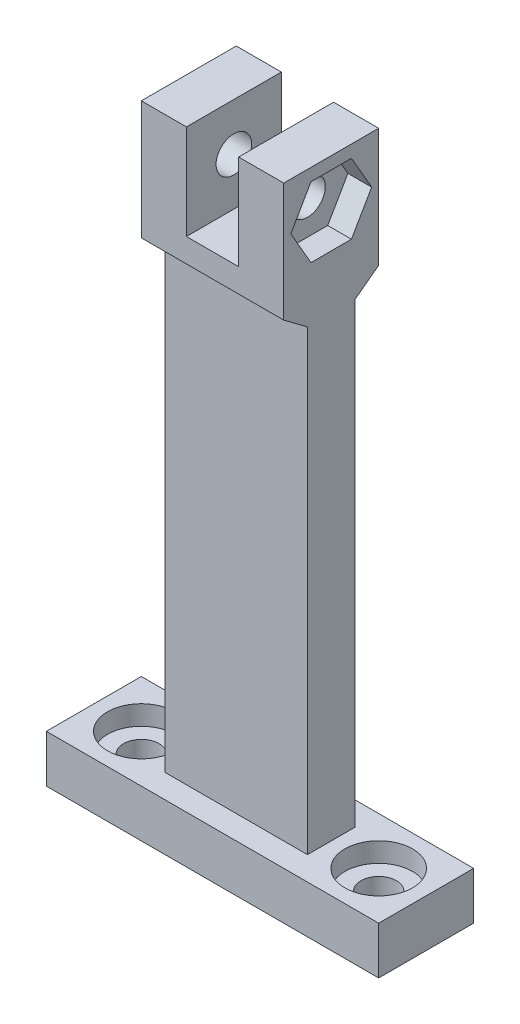
ISO-10303-21;
HEADER;
FILE_DESCRIPTION(('STEP AP214'),'2;1');
FILE_NAME('part.step','',(''),(''),'','','');
FILE_SCHEMA(('AUTOMOTIVE_DESIGN { 1 0 10303 214 1 1 1 1 }'));
ENDSEC;
DATA;
#1=APPLICATION_CONTEXT('core data for automotive mechanical design processes');
#2=APPLICATION_PROTOCOL_DEFINITION('international standard','automotive_design',2000,#1);
#3=PRODUCT_CONTEXT('',#1,'mechanical');
#4=PRODUCT('Part','Part','',(#3));
#5=PRODUCT_RELATED_PRODUCT_CATEGORY('part','',(#4));
#6=PRODUCT_DEFINITION_FORMATION('','',#4);
#7=PRODUCT_DEFINITION_CONTEXT('part definition',#1,'design');
#8=PRODUCT_DEFINITION('design','',#6,#7);
#9=PRODUCT_DEFINITION_SHAPE('','',#8);
#10=(LENGTH_UNIT() NAMED_UNIT(*) SI_UNIT(.MILLI.,.METRE.));
#11=(NAMED_UNIT(*) PLANE_ANGLE_UNIT() SI_UNIT($,.RADIAN.));
#12=(NAMED_UNIT(*) SI_UNIT($,.STERADIAN.) SOLID_ANGLE_UNIT());
#13=UNCERTAINTY_MEASURE_WITH_UNIT(LENGTH_MEASURE(1.E-05),#10,'distance_accuracy_value','');
#14=(GEOMETRIC_REPRESENTATION_CONTEXT(3) GLOBAL_UNCERTAINTY_ASSIGNED_CONTEXT((#13)) GLOBAL_UNIT_ASSIGNED_CONTEXT((#10,
#11,#12)) REPRESENTATION_CONTEXT('',''));
#15=CARTESIAN_POINT('',(0.,0.,0.));
#16=DIRECTION('',(0.,0.,1.));
#17=DIRECTION('',(1.,0.,0.));
#18=AXIS2_PLACEMENT_3D('',#15,#16,#17);
#19=CARTESIAN_POINT('',(10.2426406871193,50.,0.));
#20=DIRECTION('',(-1.,0.,0.));
#21=DIRECTION('',(0.,0.,1.));
#22=AXIS2_PLACEMENT_3D('',#19,#20,#21);
#23=CYLINDRICAL_SURFACE('',#22,1.5);
#24=CARTESIAN_POINT('',(2.2,50.,0.));
#25=DIRECTION('',(1.,0.,0.));
#26=DIRECTION('',(0.,1.,0.));
#27=AXIS2_PLACEMENT_3D('',#24,#25,#26);
#28=CIRCLE('',#27,1.5);
#29=CARTESIAN_POINT('',(2.2,51.5,0.));
#30=VERTEX_POINT('',#29);
#31=EDGE_CURVE('E269',#30,#30,#28,.T.);
#32=ORIENTED_EDGE('',*,*,#31,.F.);
#33=EDGE_LOOP('',(#32));
#34=FACE_BOUND('',#33,.T.);
#35=CARTESIAN_POINT('',(4.,50.,0.));
#36=DIRECTION('',(1.,0.,0.));
#37=DIRECTION('',(0.,0.,-1.));
#38=AXIS2_PLACEMENT_3D('',#35,#36,#37);
#39=CIRCLE('',#38,1.5);
#40=CARTESIAN_POINT('',(4.,50.,-1.5));
#41=VERTEX_POINT('',#40);
#42=EDGE_CURVE('E39',#41,#41,#39,.F.);
#43=ORIENTED_EDGE('',*,*,#42,.F.);
#44=EDGE_LOOP('',(#43));
#45=FACE_BOUND('',#44,.T.);
#46=ADVANCED_FACE('F35',(#34,#45),#23,.F.);
#47=CARTESIAN_POINT('',(-2.2,50.,0.));
#48=DIRECTION('',(-1.,0.,0.));
#49=DIRECTION('',(0.,-1.,0.));
#50=AXIS2_PLACEMENT_3D('',#47,#48,#49);
#51=CIRCLE('',#50,1.5);
#52=CARTESIAN_POINT('',(-2.2,48.5,0.));
#53=VERTEX_POINT('',#52);
#54=EDGE_CURVE('E271',#53,#53,#51,.T.);
#55=ORIENTED_EDGE('',*,*,#54,.F.);
#56=EDGE_LOOP('',(#55));
#57=FACE_BOUND('',#56,.T.);
#58=CARTESIAN_POINT('',(-4.46,50.,0.));
#59=DIRECTION('',(-1.,0.,0.));
#60=DIRECTION('',(0.,0.,1.));
#61=AXIS2_PLACEMENT_3D('',#58,#59,#60);
#62=CIRCLE('',#61,1.5);
#63=CARTESIAN_POINT('',(-4.46,50.,1.5));
#64=VERTEX_POINT('',#63);
#65=EDGE_CURVE('E284',#64,#64,#62,.T.);
#66=ORIENTED_EDGE('',*,*,#65,.T.);
#67=EDGE_LOOP('',(#66));
#68=FACE_BOUND('',#67,.T.);
#69=ADVANCED_FACE('F443',(#57,#68),#23,.F.);
#70=CARTESIAN_POINT('',(0.,54.,0.));
#71=DIRECTION('',(0.,1.,0.));
#72=DIRECTION('',(0.,0.,1.));
#73=AXIS2_PLACEMENT_3D('',#70,#71,#72);
#74=PLANE('',#73);
#75=DIRECTION('',(0.,0.,1.));
#76=VECTOR('',#75,1.);
#77=CARTESIAN_POINT('',(-2.2,54.,-4.));
#78=LINE('',#77,#76);
#79=CARTESIAN_POINT('',(-2.2,54.,-4.));
#80=VERTEX_POINT('',#79);
#81=CARTESIAN_POINT('',(-2.2,54.,4.));
#82=VERTEX_POINT('',#81);
#83=EDGE_CURVE('E305',#80,#82,#78,.T.);
#84=ORIENTED_EDGE('',*,*,#83,.F.);
#85=DIRECTION('',(-1.,0.,0.));
#86=VECTOR('',#85,1.);
#87=CARTESIAN_POINT('',(6.,54.,-4.));
#88=LINE('',#87,#86);
#89=CARTESIAN_POINT('',(-6.,54.,-4.));
#90=VERTEX_POINT('',#89);
#91=EDGE_CURVE('E322',#80,#90,#88,.T.);
#92=ORIENTED_EDGE('',*,*,#91,.T.);
#93=DIRECTION('',(0.,0.,1.));
#94=VECTOR('',#93,1.);
#95=CARTESIAN_POINT('',(-6.,54.,4.));
#96=LINE('',#95,#94);
#97=CARTESIAN_POINT('',(-6.,54.,4.));
#98=VERTEX_POINT('',#97);
#99=EDGE_CURVE('E313',#90,#98,#96,.T.);
#100=ORIENTED_EDGE('',*,*,#99,.T.);
#101=DIRECTION('',(1.,0.,0.));
#102=VECTOR('',#101,1.);
#103=CARTESIAN_POINT('',(6.,54.,4.));
#104=LINE('',#103,#102);
#105=EDGE_CURVE('E317',#98,#82,#104,.T.);
#106=ORIENTED_EDGE('',*,*,#105,.T.);
#107=EDGE_LOOP('',(#84,#92,#100,#106));
#108=FACE_BOUND('',#107,.T.);
#109=ADVANCED_FACE('F449',(#108),#74,.T.);
#110=CARTESIAN_POINT('',(0.,4.,0.));
#111=DIRECTION('',(0.,1.,0.));
#112=DIRECTION('',(0.,0.,1.));
#113=AXIS2_PLACEMENT_3D('',#110,#111,#112);
#114=PLANE('',#113);
#115=DIRECTION('',(0.,0.,-1.));
#116=VECTOR('',#115,1.);
#117=CARTESIAN_POINT('',(-14.,4.,0.));
#118=LINE('',#117,#116);
#119=CARTESIAN_POINT('',(-14.,4.,4.));
#120=VERTEX_POINT('',#119);
#121=CARTESIAN_POINT('',(-14.,4.,-4.));
#122=VERTEX_POINT('',#121);
#123=EDGE_CURVE('E232',#120,#122,#118,.T.);
#124=ORIENTED_EDGE('',*,*,#123,.F.);
#125=DIRECTION('',(-1.,0.,0.));
#126=VECTOR('',#125,1.);
#127=CARTESIAN_POINT('',(0.,4.,4.));
#128=LINE('',#127,#126);
#129=CARTESIAN_POINT('',(14.,4.,3.99999999999999));
#130=VERTEX_POINT('',#129);
#131=EDGE_CURVE('E235',#130,#120,#128,.T.);
#132=ORIENTED_EDGE('',*,*,#131,.F.);
#133=DIRECTION('',(0.,0.,-1.));
#134=VECTOR('',#133,1.);
#135=CARTESIAN_POINT('',(14.,4.,0.));
#136=LINE('',#135,#134);
#137=CARTESIAN_POINT('',(14.,4.,-4.));
#138=VERTEX_POINT('',#137);
#139=EDGE_CURVE('E239',#130,#138,#136,.T.);
#140=ORIENTED_EDGE('',*,*,#139,.T.);
#141=DIRECTION('',(-1.,0.,0.));
#142=VECTOR('',#141,1.);
#143=CARTESIAN_POINT('',(0.,4.,-4.));
#144=LINE('',#143,#142);
#145=EDGE_CURVE('E241',#138,#122,#144,.T.);
#146=ORIENTED_EDGE('',*,*,#145,.T.);
#147=EDGE_LOOP('',(#124,#132,#140,#146));
#148=FACE_BOUND('',#147,.T.);
#149=CARTESIAN_POINT('',(10.,4.,0.));
#150=DIRECTION('',(0.,-1.,0.));
#151=DIRECTION('',(0.,0.,-1.));
#152=AXIS2_PLACEMENT_3D('',#149,#150,#151);
#153=CIRCLE('',#152,2.85);
#154=CARTESIAN_POINT('',(10.,4.,-2.85));
#155=VERTEX_POINT('',#154);
#156=EDGE_CURVE('E219',#155,#155,#153,.T.);
#157=ORIENTED_EDGE('',*,*,#156,.T.);
#158=EDGE_LOOP('',(#157));
#159=FACE_BOUND('',#158,.T.);
#160=CARTESIAN_POINT('',(-9.99999999999999,4.,0.));
#161=DIRECTION('',(0.,1.,0.));
#162=DIRECTION('',(0.,0.,1.));
#163=AXIS2_PLACEMENT_3D('',#160,#161,#162);
#164=CIRCLE('',#163,2.85);
#165=CARTESIAN_POINT('',(-9.99999999999999,4.,2.85));
#166=VERTEX_POINT('',#165);
#167=EDGE_CURVE('E220',#166,#166,#164,.T.);
#168=ORIENTED_EDGE('',*,*,#167,.F.);
#169=EDGE_LOOP('',(#168));
#170=FACE_BOUND('',#169,.T.);
#171=DIRECTION('',(1.,0.,0.));
#172=VECTOR('',#171,1.);
#173=CARTESIAN_POINT('',(6.,4.,2.));
#174=LINE('',#173,#172);
#175=CARTESIAN_POINT('',(-6.,4.,2.));
#176=VERTEX_POINT('',#175);
#177=CARTESIAN_POINT('',(6.,4.,2.));
#178=VERTEX_POINT('',#177);
#179=EDGE_CURVE('E343',#176,#178,#174,.T.);
#180=ORIENTED_EDGE('',*,*,#179,.F.);
#181=DIRECTION('',(0.,0.,1.));
#182=VECTOR('',#181,1.);
#183=CARTESIAN_POINT('',(-6.,4.,2.));
#184=LINE('',#183,#182);
#185=CARTESIAN_POINT('',(-6.,4.,-2.));
#186=VERTEX_POINT('',#185);
#187=EDGE_CURVE('E340',#186,#176,#184,.T.);
#188=ORIENTED_EDGE('',*,*,#187,.F.);
#189=DIRECTION('',(-1.,0.,0.));
#190=VECTOR('',#189,1.);
#191=CARTESIAN_POINT('',(6.,4.,-2.));
#192=LINE('',#191,#190);
#193=CARTESIAN_POINT('',(6.,4.,-2.));
#194=VERTEX_POINT('',#193);
#195=EDGE_CURVE('E214',#194,#186,#192,.T.);
#196=ORIENTED_EDGE('',*,*,#195,.F.);
#197=DIRECTION('',(0.,0.,-1.));
#198=VECTOR('',#197,1.);
#199=CARTESIAN_POINT('',(6.,4.,2.));
#200=LINE('',#199,#198);
#201=EDGE_CURVE('E208',#178,#194,#200,.T.);
#202=ORIENTED_EDGE('',*,*,#201,.F.);
#203=EDGE_LOOP('',(#180,#188,#196,#202));
#204=FACE_BOUND('',#203,.T.);
#205=ADVANCED_FACE('F349',(#148,#159,#170,#204),#114,.T.);
#206=CARTESIAN_POINT('',(-9.99999999999999,4.,0.));
#207=DIRECTION('',(0.,-1.,0.));
#208=DIRECTION('',(0.,0.,-1.));
#209=AXIS2_PLACEMENT_3D('',#206,#207,#208);
#210=CYLINDRICAL_SURFACE('',#209,1.5);
#211=CARTESIAN_POINT('',(-9.99999999999999,0.,0.));
#212=DIRECTION('',(0.,1.,0.));
#213=DIRECTION('',(0.,0.,1.));
#214=AXIS2_PLACEMENT_3D('',#211,#212,#213);
#215=CIRCLE('',#214,1.5);
#216=CARTESIAN_POINT('',(-9.99999999999999,0.,1.5));
#217=VERTEX_POINT('',#216);
#218=EDGE_CURVE('E236',#217,#217,#215,.T.);
#219=ORIENTED_EDGE('',*,*,#218,.F.);
#220=EDGE_LOOP('',(#219));
#221=FACE_BOUND('',#220,.T.);
#222=CARTESIAN_POINT('',(-9.99999999999999,2.35,0.));
#223=DIRECTION('',(0.,1.,0.));
#224=DIRECTION('',(0.,0.,1.));
#225=AXIS2_PLACEMENT_3D('',#222,#223,#224);
#226=CIRCLE('',#225,1.5);
#227=CARTESIAN_POINT('',(-9.99999999999999,2.35,1.5));
#228=VERTEX_POINT('',#227);
#229=EDGE_CURVE('E223',#228,#228,#226,.T.);
#230=ORIENTED_EDGE('',*,*,#229,.T.);
#231=EDGE_LOOP('',(#230));
#232=FACE_BOUND('',#231,.T.);
#233=ADVANCED_FACE('F508',(#221,#232),#210,.F.);
#234=CARTESIAN_POINT('',(-14.,4.,0.));
#235=DIRECTION('',(-1.,0.,0.));
#236=DIRECTION('',(0.,0.,1.));
#237=AXIS2_PLACEMENT_3D('',#234,#235,#236);
#238=PLANE('',#237);
#239=DIRECTION('',(0.,0.,-1.));
#240=VECTOR('',#239,1.);
#241=CARTESIAN_POINT('',(-14.,0.,0.));
#242=LINE('',#241,#240);
#243=CARTESIAN_POINT('',(-14.,0.,4.));
#244=VERTEX_POINT('',#243);
#245=CARTESIAN_POINT('',(-14.,0.,-4.));
#246=VERTEX_POINT('',#245);
#247=EDGE_CURVE('E244',#244,#246,#242,.T.);
#248=ORIENTED_EDGE('',*,*,#247,.F.);
#249=DIRECTION('',(0.,-1.,0.));
#250=VECTOR('',#249,1.);
#251=CARTESIAN_POINT('',(-14.,4.,4.));
#252=LINE('',#251,#250);
#253=EDGE_CURVE('E11',#120,#244,#252,.T.);
#254=ORIENTED_EDGE('',*,*,#253,.F.);
#255=ORIENTED_EDGE('',*,*,#123,.T.);
#256=DIRECTION('',(0.,-1.,0.));
#257=VECTOR('',#256,1.);
#258=CARTESIAN_POINT('',(-14.,4.,-4.));
#259=LINE('',#258,#257);
#260=EDGE_CURVE('E243',#122,#246,#259,.T.);
#261=ORIENTED_EDGE('',*,*,#260,.T.);
#262=EDGE_LOOP('',(#248,#254,#255,#261));
#263=FACE_BOUND('',#262,.T.);
#264=ADVANCED_FACE('F37',(#263),#238,.T.);
#265=CARTESIAN_POINT('',(0.,4.,4.));
#266=DIRECTION('',(0.,0.,1.));
#267=DIRECTION('',(1.,0.,0.));
#268=AXIS2_PLACEMENT_3D('',#265,#266,#267);
#269=PLANE('',#268);
#270=DIRECTION('',(-1.,0.,0.));
#271=VECTOR('',#270,1.);
#272=CARTESIAN_POINT('',(0.,0.,4.));
#273=LINE('',#272,#271);
#274=CARTESIAN_POINT('',(14.,0.,3.99999999999999));
#275=VERTEX_POINT('',#274);
#276=EDGE_CURVE('E247',#275,#244,#273,.T.);
#277=ORIENTED_EDGE('',*,*,#276,.F.);
#278=DIRECTION('',(0.,-1.,0.));
#279=VECTOR('',#278,1.);
#280=CARTESIAN_POINT('',(14.,4.,3.99999999999999));
#281=LINE('',#280,#279);
#282=EDGE_CURVE('E44',#130,#275,#281,.T.);
#283=ORIENTED_EDGE('',*,*,#282,.F.);
#284=ORIENTED_EDGE('',*,*,#131,.T.);
#285=ORIENTED_EDGE('',*,*,#253,.T.);
#286=EDGE_LOOP('',(#277,#283,#284,#285));
#287=FACE_BOUND('',#286,.T.);
#288=ADVANCED_FACE('F526',(#287),#269,.T.);
#289=CARTESIAN_POINT('',(14.,4.,0.));
#290=DIRECTION('',(-1.,0.,0.));
#291=DIRECTION('',(0.,0.,1.));
#292=AXIS2_PLACEMENT_3D('',#289,#290,#291);
#293=PLANE('',#292);
#294=DIRECTION('',(0.,0.,-1.));
#295=VECTOR('',#294,1.);
#296=CARTESIAN_POINT('',(14.,0.,0.));
#297=LINE('',#296,#295);
#298=CARTESIAN_POINT('',(14.,0.,-4.));
#299=VERTEX_POINT('',#298);
#300=EDGE_CURVE('E251',#275,#299,#297,.T.);
#301=ORIENTED_EDGE('',*,*,#300,.T.);
#302=DIRECTION('',(0.,-1.,0.));
#303=VECTOR('',#302,1.);
#304=CARTESIAN_POINT('',(14.,4.,-4.));
#305=LINE('',#304,#303);
#306=EDGE_CURVE('E262',#138,#299,#305,.T.);
#307=ORIENTED_EDGE('',*,*,#306,.F.);
#308=ORIENTED_EDGE('',*,*,#139,.F.);
#309=ORIENTED_EDGE('',*,*,#282,.T.);
#310=EDGE_LOOP('',(#301,#307,#308,#309));
#311=FACE_BOUND('',#310,.T.);
#312=ADVANCED_FACE('F520',(#311),#293,.F.);
#313=CARTESIAN_POINT('',(10.,4.,0.));
#314=DIRECTION('',(0.,-1.,0.));
#315=DIRECTION('',(0.,0.,-1.));
#316=AXIS2_PLACEMENT_3D('',#313,#314,#315);
#317=CYLINDRICAL_SURFACE('',#316,1.5);
#318=CARTESIAN_POINT('',(10.,2.35,0.));
#319=DIRECTION('',(0.,-1.,0.));
#320=DIRECTION('',(0.,0.,-1.));
#321=AXIS2_PLACEMENT_3D('',#318,#319,#320);
#322=CIRCLE('',#321,1.5);
#323=CARTESIAN_POINT('',(10.,2.35,-1.5));
#324=VERTEX_POINT('',#323);
#325=EDGE_CURVE('E248',#324,#324,#322,.F.);
#326=ORIENTED_EDGE('',*,*,#325,.T.);
#327=EDGE_LOOP('',(#326));
#328=FACE_BOUND('',#327,.T.);
#329=CARTESIAN_POINT('',(10.,0.,0.));
#330=DIRECTION('',(0.,1.,0.));
#331=DIRECTION('',(0.,0.,1.));
#332=AXIS2_PLACEMENT_3D('',#329,#330,#331);
#333=CIRCLE('',#332,1.5);
#334=CARTESIAN_POINT('',(10.,0.,1.5));
#335=VERTEX_POINT('',#334);
#336=EDGE_CURVE('E256',#335,#335,#333,.F.);
#337=ORIENTED_EDGE('',*,*,#336,.T.);
#338=EDGE_LOOP('',(#337));
#339=FACE_BOUND('',#338,.T.);
#340=ADVANCED_FACE('F517',(#328,#339),#317,.F.);
#341=CARTESIAN_POINT('',(0.,4.,-4.));
#342=DIRECTION('',(0.,0.,1.));
#343=DIRECTION('',(1.,0.,0.));
#344=AXIS2_PLACEMENT_3D('',#341,#342,#343);
#345=PLANE('',#344);
#346=DIRECTION('',(-1.,0.,0.));
#347=VECTOR('',#346,1.);
#348=CARTESIAN_POINT('',(0.,0.,-4.));
#349=LINE('',#348,#347);
#350=EDGE_CURVE('E253',#299,#246,#349,.T.);
#351=ORIENTED_EDGE('',*,*,#350,.T.);
#352=ORIENTED_EDGE('',*,*,#260,.F.);
#353=ORIENTED_EDGE('',*,*,#145,.F.);
#354=ORIENTED_EDGE('',*,*,#306,.T.);
#355=EDGE_LOOP('',(#351,#352,#353,#354));
#356=FACE_BOUND('',#355,.T.);
#357=ADVANCED_FACE('F512',(#356),#345,.F.);
#358=CARTESIAN_POINT('',(0.,0.,0.));
#359=DIRECTION('',(0.,1.,0.));
#360=DIRECTION('',(0.,0.,1.));
#361=AXIS2_PLACEMENT_3D('',#358,#359,#360);
#362=PLANE('',#361);
#363=ORIENTED_EDGE('',*,*,#247,.T.);
#364=ORIENTED_EDGE('',*,*,#350,.F.);
#365=ORIENTED_EDGE('',*,*,#300,.F.);
#366=ORIENTED_EDGE('',*,*,#276,.T.);
#367=EDGE_LOOP('',(#363,#364,#365,#366));
#368=FACE_BOUND('',#367,.T.);
#369=ORIENTED_EDGE('',*,*,#336,.F.);
#370=EDGE_LOOP('',(#369));
#371=FACE_BOUND('',#370,.T.);
#372=ORIENTED_EDGE('',*,*,#218,.T.);
#373=EDGE_LOOP('',(#372));
#374=FACE_BOUND('',#373,.T.);
#375=ADVANCED_FACE('F504',(#368,#371,#374),#362,.F.);
#376=CARTESIAN_POINT('',(10.,2.35,0.));
#377=DIRECTION('',(0.,-1.,0.));
#378=DIRECTION('',(0.,0.,-1.));
#379=AXIS2_PLACEMENT_3D('',#376,#377,#378);
#380=PLANE('',#379);
#381=CARTESIAN_POINT('',(10.,2.35,0.));
#382=DIRECTION('',(0.,-1.,0.));
#383=DIRECTION('',(0.,0.,-1.));
#384=AXIS2_PLACEMENT_3D('',#381,#382,#383);
#385=CIRCLE('',#384,2.85);
#386=CARTESIAN_POINT('',(10.,2.35,-2.85));
#387=VERTEX_POINT('',#386);
#388=EDGE_CURVE('E227',#387,#387,#385,.T.);
#389=ORIENTED_EDGE('',*,*,#388,.F.);
#390=EDGE_LOOP('',(#389));
#391=FACE_BOUND('',#390,.T.);
#392=ORIENTED_EDGE('',*,*,#325,.F.);
#393=EDGE_LOOP('',(#392));
#394=FACE_BOUND('',#393,.T.);
#395=ADVANCED_FACE('F500',(#391,#394),#380,.F.);
#396=CARTESIAN_POINT('',(10.,4.,0.));
#397=DIRECTION('',(0.,-1.,0.));
#398=DIRECTION('',(0.,0.,-1.));
#399=AXIS2_PLACEMENT_3D('',#396,#397,#398);
#400=CYLINDRICAL_SURFACE('',#399,2.85);
#401=ORIENTED_EDGE('',*,*,#156,.F.);
#402=EDGE_LOOP('',(#401));
#403=FACE_BOUND('',#402,.T.);
#404=ORIENTED_EDGE('',*,*,#388,.T.);
#405=EDGE_LOOP('',(#404));
#406=FACE_BOUND('',#405,.T.);
#407=ADVANCED_FACE('F496',(#403,#406),#400,.F.);
#408=CARTESIAN_POINT('',(-9.99999999999999,4.,0.));
#409=DIRECTION('',(0.,-1.,0.));
#410=DIRECTION('',(0.,0.,-1.));
#411=AXIS2_PLACEMENT_3D('',#408,#409,#410);
#412=CYLINDRICAL_SURFACE('',#411,2.85);
#413=ORIENTED_EDGE('',*,*,#167,.T.);
#414=EDGE_LOOP('',(#413));
#415=FACE_BOUND('',#414,.T.);
#416=CARTESIAN_POINT('',(-9.99999999999999,2.35,0.));
#417=DIRECTION('',(0.,1.,0.));
#418=DIRECTION('',(0.,0.,1.));
#419=AXIS2_PLACEMENT_3D('',#416,#417,#418);
#420=CIRCLE('',#419,2.85);
#421=CARTESIAN_POINT('',(-9.99999999999999,2.35,2.85));
#422=VERTEX_POINT('',#421);
#423=EDGE_CURVE('E224',#422,#422,#420,.T.);
#424=ORIENTED_EDGE('',*,*,#423,.F.);
#425=EDGE_LOOP('',(#424));
#426=FACE_BOUND('',#425,.T.);
#427=ADVANCED_FACE('F492',(#415,#426),#412,.F.);
#428=CARTESIAN_POINT('',(-9.99999999999999,2.35,0.));
#429=DIRECTION('',(0.,1.,0.));
#430=DIRECTION('',(0.,0.,1.));
#431=AXIS2_PLACEMENT_3D('',#428,#429,#430);
#432=PLANE('',#431);
#433=ORIENTED_EDGE('',*,*,#229,.F.);
#434=EDGE_LOOP('',(#433));
#435=FACE_BOUND('',#434,.T.);
#436=ORIENTED_EDGE('',*,*,#423,.T.);
#437=EDGE_LOOP('',(#436));
#438=FACE_BOUND('',#437,.T.);
#439=ADVANCED_FACE('F489',(#435,#438),#432,.T.);
#440=CARTESIAN_POINT('',(-6.,44.,2.));
#441=DIRECTION('',(1.,0.,0.));
#442=DIRECTION('',(0.,0.,-1.));
#443=AXIS2_PLACEMENT_3D('',#440,#441,#442);
#444=PLANE('',#443);
#445=DIRECTION('',(0.,-0.6,0.8));
#446=VECTOR('',#445,1.);
#447=CARTESIAN_POINT('',(-6.,42.5,-2.));
#448=LINE('',#447,#446);
#449=CARTESIAN_POINT('',(-6.,44.,-4.));
#450=VERTEX_POINT('',#449);
#451=CARTESIAN_POINT('',(-6.,42.5,-2.));
#452=VERTEX_POINT('',#451);
#453=EDGE_CURVE('E203',#450,#452,#448,.T.);
#454=ORIENTED_EDGE('',*,*,#453,.T.);
#455=DIRECTION('',(0.,-1.,0.));
#456=VECTOR('',#455,1.);
#457=CARTESIAN_POINT('',(-6.,44.,-2.));
#458=LINE('',#457,#456);
#459=EDGE_CURVE('E202',#452,#186,#458,.T.);
#460=ORIENTED_EDGE('',*,*,#459,.T.);
#461=ORIENTED_EDGE('',*,*,#187,.T.);
#462=DIRECTION('',(0.,-1.,0.));
#463=VECTOR('',#462,1.);
#464=CARTESIAN_POINT('',(-6.,44.,2.));
#465=LINE('',#464,#463);
#466=CARTESIAN_POINT('',(-6.,42.5,2.));
#467=VERTEX_POINT('',#466);
#468=EDGE_CURVE('E212',#467,#176,#465,.T.);
#469=ORIENTED_EDGE('',*,*,#468,.F.);
#470=DIRECTION('',(0.,0.6,0.8));
#471=VECTOR('',#470,1.);
#472=CARTESIAN_POINT('',(-6.,42.5,2.));
#473=LINE('',#472,#471);
#474=CARTESIAN_POINT('',(-6.,44.,4.));
#475=VERTEX_POINT('',#474);
#476=EDGE_CURVE('E362',#467,#475,#473,.T.);
#477=ORIENTED_EDGE('',*,*,#476,.T.);
#478=DIRECTION('',(0.,-1.,0.));
#479=VECTOR('',#478,1.);
#480=CARTESIAN_POINT('',(-6.,54.,4.));
#481=LINE('',#480,#479);
#482=EDGE_CURVE('E337',#98,#475,#481,.T.);
#483=ORIENTED_EDGE('',*,*,#482,.F.);
#484=ORIENTED_EDGE('',*,*,#99,.F.);
#485=DIRECTION('',(0.,-1.,0.));
#486=VECTOR('',#485,1.);
#487=CARTESIAN_POINT('',(-6.,54.,-4.));
#488=LINE('',#487,#486);
#489=EDGE_CURVE('E326',#90,#450,#488,.T.);
#490=ORIENTED_EDGE('',*,*,#489,.T.);
#491=EDGE_LOOP('',(#454,#460,#461,#469,#477,#483,#484,#490));
#492=FACE_BOUND('',#491,.T.);
#493=CARTESIAN_POINT('',(-6.,50.,0.));
#494=DIRECTION('',(-1.,0.,0.));
#495=DIRECTION('',(0.,0.,1.));
#496=AXIS2_PLACEMENT_3D('',#493,#494,#495);
#497=CIRCLE('',#496,2.85);
#498=CARTESIAN_POINT('',(-6.,50.,2.85));
#499=VERTEX_POINT('',#498);
#500=EDGE_CURVE('E279',#499,#499,#497,.T.);
#501=ORIENTED_EDGE('',*,*,#500,.F.);
#502=EDGE_LOOP('',(#501));
#503=FACE_BOUND('',#502,.T.);
#504=ADVANCED_FACE('F352',(#492,#503),#444,.F.);
#505=CARTESIAN_POINT('',(6.,44.,2.));
#506=DIRECTION('',(0.,0.,-1.));
#507=DIRECTION('',(-1.,0.,0.));
#508=AXIS2_PLACEMENT_3D('',#505,#506,#507);
#509=PLANE('',#508);
#510=DIRECTION('',(0.,-1.,0.));
#511=VECTOR('',#510,1.);
#512=CARTESIAN_POINT('',(6.,44.,2.));
#513=LINE('',#512,#511);
#514=CARTESIAN_POINT('',(6.,42.5,2.));
#515=VERTEX_POINT('',#514);
#516=EDGE_CURVE('E210',#515,#178,#513,.T.);
#517=ORIENTED_EDGE('',*,*,#516,.F.);
#518=DIRECTION('',(1.,0.,0.));
#519=VECTOR('',#518,1.);
#520=CARTESIAN_POINT('',(-8.5,42.5,2.));
#521=LINE('',#520,#519);
#522=EDGE_CURVE('E359',#467,#515,#521,.T.);
#523=ORIENTED_EDGE('',*,*,#522,.F.);
#524=ORIENTED_EDGE('',*,*,#468,.T.);
#525=ORIENTED_EDGE('',*,*,#179,.T.);
#526=EDGE_LOOP('',(#517,#523,#524,#525));
#527=FACE_BOUND('',#526,.T.);
#528=ADVANCED_FACE('F483',(#527),#509,.F.);
#529=CARTESIAN_POINT('',(6.,44.,2.));
#530=DIRECTION('',(-1.,0.,0.));
#531=DIRECTION('',(0.,0.,1.));
#532=AXIS2_PLACEMENT_3D('',#529,#530,#531);
#533=PLANE('',#532);
#534=DIRECTION('',(0.,-1.,0.));
#535=VECTOR('',#534,1.);
#536=CARTESIAN_POINT('',(6.,44.,-2.));
#537=LINE('',#536,#535);
#538=CARTESIAN_POINT('',(6.,42.5,-2.));
#539=VERTEX_POINT('',#538);
#540=EDGE_CURVE('E200',#539,#194,#537,.T.);
#541=ORIENTED_EDGE('',*,*,#540,.F.);
#542=DIRECTION('',(0.,0.6,-0.8));
#543=VECTOR('',#542,1.);
#544=CARTESIAN_POINT('',(6.,42.5,-2.));
#545=LINE('',#544,#543);
#546=CARTESIAN_POINT('',(6.,44.,-4.));
#547=VERTEX_POINT('',#546);
#548=EDGE_CURVE('E185',#539,#547,#545,.T.);
#549=ORIENTED_EDGE('',*,*,#548,.T.);
#550=DIRECTION('',(0.,-1.,0.));
#551=VECTOR('',#550,1.);
#552=CARTESIAN_POINT('',(6.,54.,-4.));
#553=LINE('',#552,#551);
#554=CARTESIAN_POINT('',(6.,54.,-4.));
#555=VERTEX_POINT('',#554);
#556=EDGE_CURVE('E332',#555,#547,#553,.T.);
#557=ORIENTED_EDGE('',*,*,#556,.F.);
#558=DIRECTION('',(0.,0.,-1.));
#559=VECTOR('',#558,1.);
#560=CARTESIAN_POINT('',(6.,54.,4.));
#561=LINE('',#560,#559);
#562=CARTESIAN_POINT('',(6.,54.,4.));
#563=VERTEX_POINT('',#562);
#564=EDGE_CURVE('E320',#563,#555,#561,.T.);
#565=ORIENTED_EDGE('',*,*,#564,.F.);
#566=DIRECTION('',(0.,-1.,0.));
#567=VECTOR('',#566,1.);
#568=CARTESIAN_POINT('',(6.,54.,4.));
#569=LINE('',#568,#567);
#570=CARTESIAN_POINT('',(6.,44.,4.));
#571=VERTEX_POINT('',#570);
#572=EDGE_CURVE('E334',#563,#571,#569,.T.);
#573=ORIENTED_EDGE('',*,*,#572,.T.);
#574=DIRECTION('',(0.,-0.6,-0.8));
#575=VECTOR('',#574,1.);
#576=CARTESIAN_POINT('',(6.,42.5,2.));
#577=LINE('',#576,#575);
#578=EDGE_CURVE('E356',#571,#515,#577,.T.);
#579=ORIENTED_EDGE('',*,*,#578,.T.);
#580=ORIENTED_EDGE('',*,*,#516,.T.);
#581=ORIENTED_EDGE('',*,*,#201,.T.);
#582=EDGE_LOOP('',(#541,#549,#557,#565,#573,#579,#580,#581));
#583=FACE_BOUND('',#582,.T.);
#584=DIRECTION('',(0.,-0.866025403784442,-0.499999999999993));
#585=VECTOR('',#584,1.);
#586=CARTESIAN_POINT('',(6.,50.,3.4063665882188));
#587=LINE('',#586,#585);
#588=CARTESIAN_POINT('',(6.,50.,3.4063665882188));
#589=VERTEX_POINT('',#588);
#590=CARTESIAN_POINT('',(6.,47.05,1.70318329410942));
#591=VERTEX_POINT('',#590);
#592=EDGE_CURVE('E386',#589,#591,#587,.T.);
#593=ORIENTED_EDGE('',*,*,#592,.F.);
#594=DIRECTION('',(0.,-0.866025403784435,0.500000000000006));
#595=VECTOR('',#594,1.);
#596=CARTESIAN_POINT('',(6.,52.95,1.70318329410937));
#597=LINE('',#596,#595);
#598=CARTESIAN_POINT('',(6.,52.95,1.70318329410937));
#599=VERTEX_POINT('',#598);
#600=EDGE_CURVE('E52',#599,#589,#597,.T.);
#601=ORIENTED_EDGE('',*,*,#600,.F.);
#602=DIRECTION('',(0.,0.,1.));
#603=VECTOR('',#602,1.);
#604=CARTESIAN_POINT('',(6.,52.95,-1.70318329410941));
#605=LINE('',#604,#603);
#606=CARTESIAN_POINT('',(6.,52.95,-1.70318329410941));
#607=VERTEX_POINT('',#606);
#608=EDGE_CURVE('E369',#607,#599,#605,.T.);
#609=ORIENTED_EDGE('',*,*,#608,.F.);
#610=DIRECTION('',(0.,0.866025403784442,0.499999999999993));
#611=VECTOR('',#610,1.);
#612=CARTESIAN_POINT('',(6.,50.,-3.40636658821879));
#613=LINE('',#612,#611);
#614=CARTESIAN_POINT('',(6.,50.,-3.40636658821879));
#615=VERTEX_POINT('',#614);
#616=EDGE_CURVE('E395',#615,#607,#613,.T.);
#617=ORIENTED_EDGE('',*,*,#616,.F.);
#618=DIRECTION('',(0.,0.866025403784435,-0.500000000000006));
#619=VECTOR('',#618,1.);
#620=CARTESIAN_POINT('',(6.,47.05,-1.70318329410937));
#621=LINE('',#620,#619);
#622=CARTESIAN_POINT('',(6.,47.05,-1.70318329410937));
#623=VERTEX_POINT('',#622);
#624=EDGE_CURVE('E392',#623,#615,#621,.T.);
#625=ORIENTED_EDGE('',*,*,#624,.F.);
#626=DIRECTION('',(0.,0.,-1.));
#627=VECTOR('',#626,1.);
#628=CARTESIAN_POINT('',(6.,47.05,1.70318329410942));
#629=LINE('',#628,#627);
#630=EDGE_CURVE('E389',#591,#623,#629,.T.);
#631=ORIENTED_EDGE('',*,*,#630,.F.);
#632=EDGE_LOOP('',(#593,#601,#609,#617,#625,#631));
#633=FACE_BOUND('',#632,.T.);
#634=ADVANCED_FACE('F205',(#583,#633),#533,.F.);
#635=CARTESIAN_POINT('',(6.,44.,-2.));
#636=DIRECTION('',(0.,0.,1.));
#637=DIRECTION('',(1.,0.,0.));
#638=AXIS2_PLACEMENT_3D('',#635,#636,#637);
#639=PLANE('',#638);
#640=ORIENTED_EDGE('',*,*,#459,.F.);
#641=DIRECTION('',(1.,0.,0.));
#642=VECTOR('',#641,1.);
#643=CARTESIAN_POINT('',(-8.5,42.5,-2.));
#644=LINE('',#643,#642);
#645=EDGE_CURVE('E188',#452,#539,#644,.T.);
#646=ORIENTED_EDGE('',*,*,#645,.T.);
#647=ORIENTED_EDGE('',*,*,#540,.T.);
#648=ORIENTED_EDGE('',*,*,#195,.T.);
#649=EDGE_LOOP('',(#640,#646,#647,#648));
#650=FACE_BOUND('',#649,.T.);
#651=ADVANCED_FACE('F198',(#650),#639,.F.);
#652=CARTESIAN_POINT('',(6.,54.,4.));
#653=DIRECTION('',(0.,0.,-1.));
#654=DIRECTION('',(-1.,0.,0.));
#655=AXIS2_PLACEMENT_3D('',#652,#653,#654);
#656=PLANE('',#655);
#657=DIRECTION('',(1.,0.,0.));
#658=VECTOR('',#657,1.);
#659=CARTESIAN_POINT('',(-2.2,46.,4.));
#660=LINE('',#659,#658);
#661=CARTESIAN_POINT('',(-2.2,46.,4.));
#662=VERTEX_POINT('',#661);
#663=CARTESIAN_POINT('',(2.2,46.,4.));
#664=VERTEX_POINT('',#663);
#665=EDGE_CURVE('E301',#662,#664,#660,.T.);
#666=ORIENTED_EDGE('',*,*,#665,.F.);
#667=DIRECTION('',(0.,-1.,0.));
#668=VECTOR('',#667,1.);
#669=CARTESIAN_POINT('',(-2.2,54.,4.));
#670=LINE('',#669,#668);
#671=EDGE_CURVE('E276',#82,#662,#670,.T.);
#672=ORIENTED_EDGE('',*,*,#671,.F.);
#673=ORIENTED_EDGE('',*,*,#105,.F.);
#674=ORIENTED_EDGE('',*,*,#482,.T.);
#675=DIRECTION('',(1.,0.,0.));
#676=VECTOR('',#675,1.);
#677=CARTESIAN_POINT('',(6.,44.,4.));
#678=LINE('',#677,#676);
#679=EDGE_CURVE('E307',#475,#571,#678,.T.);
#680=ORIENTED_EDGE('',*,*,#679,.T.);
#681=ORIENTED_EDGE('',*,*,#572,.F.);
#682=CARTESIAN_POINT('',(2.2,54.,4.));
#683=VERTEX_POINT('',#682);
#684=EDGE_CURVE('E316',#683,#563,#104,.T.);
#685=ORIENTED_EDGE('',*,*,#684,.F.);
#686=DIRECTION('',(0.,1.,0.));
#687=VECTOR('',#686,1.);
#688=CARTESIAN_POINT('',(2.2,54.,4.));
#689=LINE('',#688,#687);
#690=EDGE_CURVE('E60',#664,#683,#689,.T.);
#691=ORIENTED_EDGE('',*,*,#690,.F.);
#692=EDGE_LOOP('',(#666,#672,#673,#674,#680,#681,#685,#691));
#693=FACE_BOUND('',#692,.T.);
#694=ADVANCED_FACE('F474',(#693),#656,.F.);
#695=CARTESIAN_POINT('',(6.,54.,-4.));
#696=DIRECTION('',(0.,0.,1.));
#697=DIRECTION('',(1.,0.,0.));
#698=AXIS2_PLACEMENT_3D('',#695,#696,#697);
#699=PLANE('',#698);
#700=ORIENTED_EDGE('',*,*,#91,.F.);
#701=DIRECTION('',(0.,-1.,0.));
#702=VECTOR('',#701,1.);
#703=CARTESIAN_POINT('',(-2.2,54.,-4.));
#704=LINE('',#703,#702);
#705=CARTESIAN_POINT('',(-2.2,46.,-4.));
#706=VERTEX_POINT('',#705);
#707=EDGE_CURVE('E289',#80,#706,#704,.T.);
#708=ORIENTED_EDGE('',*,*,#707,.T.);
#709=DIRECTION('',(1.,0.,0.));
#710=VECTOR('',#709,1.);
#711=CARTESIAN_POINT('',(-2.2,46.,-4.));
#712=LINE('',#711,#710);
#713=CARTESIAN_POINT('',(2.2,46.,-4.));
#714=VERTEX_POINT('',#713);
#715=EDGE_CURVE('E292',#706,#714,#712,.T.);
#716=ORIENTED_EDGE('',*,*,#715,.T.);
#717=DIRECTION('',(0.,1.,0.));
#718=VECTOR('',#717,1.);
#719=CARTESIAN_POINT('',(2.2,54.,-4.));
#720=LINE('',#719,#718);
#721=CARTESIAN_POINT('',(2.2,54.,-4.));
#722=VERTEX_POINT('',#721);
#723=EDGE_CURVE('E295',#714,#722,#720,.T.);
#724=ORIENTED_EDGE('',*,*,#723,.T.);
#725=EDGE_CURVE('E323',#555,#722,#88,.T.);
#726=ORIENTED_EDGE('',*,*,#725,.F.);
#727=ORIENTED_EDGE('',*,*,#556,.T.);
#728=DIRECTION('',(-1.,0.,0.));
#729=VECTOR('',#728,1.);
#730=CARTESIAN_POINT('',(6.,44.,-4.));
#731=LINE('',#730,#729);
#732=EDGE_CURVE('E191',#547,#450,#731,.T.);
#733=ORIENTED_EDGE('',*,*,#732,.T.);
#734=ORIENTED_EDGE('',*,*,#489,.F.);
#735=EDGE_LOOP('',(#700,#708,#716,#724,#726,#727,#733,#734));
#736=FACE_BOUND('',#735,.T.);
#737=ADVANCED_FACE('F470',(#736),#699,.F.);
#738=DIRECTION('',(0.,0.,1.));
#739=VECTOR('',#738,1.);
#740=CARTESIAN_POINT('',(2.2,54.,-4.));
#741=LINE('',#740,#739);
#742=EDGE_CURVE('E308',#722,#683,#741,.T.);
#743=ORIENTED_EDGE('',*,*,#742,.T.);
#744=ORIENTED_EDGE('',*,*,#684,.T.);
#745=ORIENTED_EDGE('',*,*,#564,.T.);
#746=ORIENTED_EDGE('',*,*,#725,.T.);
#747=EDGE_LOOP('',(#743,#744,#745,#746));
#748=FACE_BOUND('',#747,.T.);
#749=ADVANCED_FACE('F466',(#748),#74,.T.);
#750=CARTESIAN_POINT('',(-2.2,54.,-4.));
#751=DIRECTION('',(-1.,0.,0.));
#752=DIRECTION('',(0.,-1.,0.));
#753=AXIS2_PLACEMENT_3D('',#750,#751,#752);
#754=PLANE('',#753);
#755=ORIENTED_EDGE('',*,*,#54,.T.);
#756=EDGE_LOOP('',(#755));
#757=FACE_BOUND('',#756,.T.);
#758=ORIENTED_EDGE('',*,*,#671,.T.);
#759=DIRECTION('',(0.,0.,1.));
#760=VECTOR('',#759,1.);
#761=CARTESIAN_POINT('',(-2.2,46.,-4.));
#762=LINE('',#761,#760);
#763=EDGE_CURVE('E298',#706,#662,#762,.T.);
#764=ORIENTED_EDGE('',*,*,#763,.F.);
#765=ORIENTED_EDGE('',*,*,#707,.F.);
#766=ORIENTED_EDGE('',*,*,#83,.T.);
#767=EDGE_LOOP('',(#758,#764,#765,#766));
#768=FACE_BOUND('',#767,.T.);
#769=ADVANCED_FACE('F460',(#757,#768),#754,.F.);
#770=CARTESIAN_POINT('',(2.2,54.,-4.));
#771=DIRECTION('',(1.,0.,0.));
#772=DIRECTION('',(0.,1.,0.));
#773=AXIS2_PLACEMENT_3D('',#770,#771,#772);
#774=PLANE('',#773);
#775=ORIENTED_EDGE('',*,*,#31,.T.);
#776=EDGE_LOOP('',(#775));
#777=FACE_BOUND('',#776,.T.);
#778=ORIENTED_EDGE('',*,*,#690,.T.);
#779=ORIENTED_EDGE('',*,*,#742,.F.);
#780=ORIENTED_EDGE('',*,*,#723,.F.);
#781=DIRECTION('',(0.,0.,1.));
#782=VECTOR('',#781,1.);
#783=CARTESIAN_POINT('',(2.2,46.,-4.));
#784=LINE('',#783,#782);
#785=EDGE_CURVE('E310',#714,#664,#784,.T.);
#786=ORIENTED_EDGE('',*,*,#785,.T.);
#787=EDGE_LOOP('',(#778,#779,#780,#786));
#788=FACE_BOUND('',#787,.T.);
#789=ADVANCED_FACE('F456',(#777,#788),#774,.F.);
#790=CARTESIAN_POINT('',(-2.2,46.,-4.));
#791=DIRECTION('',(0.,-1.,0.));
#792=DIRECTION('',(0.,0.,-1.));
#793=AXIS2_PLACEMENT_3D('',#790,#791,#792);
#794=PLANE('',#793);
#795=ORIENTED_EDGE('',*,*,#665,.T.);
#796=ORIENTED_EDGE('',*,*,#785,.F.);
#797=ORIENTED_EDGE('',*,*,#715,.F.);
#798=ORIENTED_EDGE('',*,*,#763,.T.);
#799=EDGE_LOOP('',(#795,#796,#797,#798));
#800=FACE_BOUND('',#799,.T.);
#801=ADVANCED_FACE('F459',(#800),#794,.F.);
#802=CARTESIAN_POINT('',(-4.46,50.,0.));
#803=DIRECTION('',(-1.,0.,0.));
#804=DIRECTION('',(0.,0.,1.));
#805=AXIS2_PLACEMENT_3D('',#802,#803,#804);
#806=CYLINDRICAL_SURFACE('',#805,2.85);
#807=CARTESIAN_POINT('',(-4.46,50.,0.));
#808=DIRECTION('',(-1.,0.,0.));
#809=DIRECTION('',(0.,0.,1.));
#810=AXIS2_PLACEMENT_3D('',#807,#808,#809);
#811=CIRCLE('',#810,2.85);
#812=CARTESIAN_POINT('',(-4.46,50.,2.85));
#813=VERTEX_POINT('',#812);
#814=EDGE_CURVE('E272',#813,#813,#811,.T.);
#815=ORIENTED_EDGE('',*,*,#814,.F.);
#816=EDGE_LOOP('',(#815));
#817=FACE_BOUND('',#816,.T.);
#818=ORIENTED_EDGE('',*,*,#500,.T.);
#819=EDGE_LOOP('',(#818));
#820=FACE_BOUND('',#819,.T.);
#821=ADVANCED_FACE('F454',(#817,#820),#806,.F.);
#822=CARTESIAN_POINT('',(-4.46,50.,0.));
#823=DIRECTION('',(-1.,0.,0.));
#824=DIRECTION('',(0.,0.,1.));
#825=AXIS2_PLACEMENT_3D('',#822,#823,#824);
#826=PLANE('',#825);
#827=ORIENTED_EDGE('',*,*,#65,.F.);
#828=EDGE_LOOP('',(#827));
#829=FACE_BOUND('',#828,.T.);
#830=ORIENTED_EDGE('',*,*,#814,.T.);
#831=EDGE_LOOP('',(#830));
#832=FACE_BOUND('',#831,.T.);
#833=ADVANCED_FACE('F600',(#829,#832),#826,.T.);
#834=CARTESIAN_POINT('',(4.,0.,0.));
#835=DIRECTION('',(1.,0.,0.));
#836=DIRECTION('',(0.,0.,-1.));
#837=AXIS2_PLACEMENT_3D('',#834,#835,#836);
#838=PLANE('',#837);
#839=DIRECTION('',(0.,-0.866025403784435,0.500000000000006));
#840=VECTOR('',#839,1.);
#841=CARTESIAN_POINT('',(4.,52.95,1.70318329410937));
#842=LINE('',#841,#840);
#843=CARTESIAN_POINT('',(4.,52.95,1.70318329410937));
#844=VERTEX_POINT('',#843);
#845=CARTESIAN_POINT('',(4.,50.,3.4063665882188));
#846=VERTEX_POINT('',#845);
#847=EDGE_CURVE('E365',#844,#846,#842,.T.);
#848=ORIENTED_EDGE('',*,*,#847,.T.);
#849=DIRECTION('',(0.,-0.866025403784442,-0.499999999999993));
#850=VECTOR('',#849,1.);
#851=CARTESIAN_POINT('',(4.,50.,3.4063665882188));
#852=LINE('',#851,#850);
#853=CARTESIAN_POINT('',(4.,47.05,1.70318329410942));
#854=VERTEX_POINT('',#853);
#855=EDGE_CURVE('E368',#846,#854,#852,.T.);
#856=ORIENTED_EDGE('',*,*,#855,.T.);
#857=DIRECTION('',(0.,0.,-1.));
#858=VECTOR('',#857,1.);
#859=CARTESIAN_POINT('',(4.,47.05,1.70318329410942));
#860=LINE('',#859,#858);
#861=CARTESIAN_POINT('',(4.,47.05,-1.70318329410937));
#862=VERTEX_POINT('',#861);
#863=EDGE_CURVE('E372',#854,#862,#860,.T.);
#864=ORIENTED_EDGE('',*,*,#863,.T.);
#865=DIRECTION('',(0.,0.866025403784435,-0.500000000000006));
#866=VECTOR('',#865,1.);
#867=CARTESIAN_POINT('',(4.,47.05,-1.70318329410937));
#868=LINE('',#867,#866);
#869=CARTESIAN_POINT('',(4.,50.,-3.40636658821879));
#870=VERTEX_POINT('',#869);
#871=EDGE_CURVE('E375',#862,#870,#868,.T.);
#872=ORIENTED_EDGE('',*,*,#871,.T.);
#873=DIRECTION('',(0.,0.866025403784442,0.499999999999993));
#874=VECTOR('',#873,1.);
#875=CARTESIAN_POINT('',(4.,50.,-3.40636658821879));
#876=LINE('',#875,#874);
#877=CARTESIAN_POINT('',(4.,52.95,-1.70318329410941));
#878=VERTEX_POINT('',#877);
#879=EDGE_CURVE('E378',#870,#878,#876,.T.);
#880=ORIENTED_EDGE('',*,*,#879,.T.);
#881=DIRECTION('',(0.,0.,1.));
#882=VECTOR('',#881,1.);
#883=CARTESIAN_POINT('',(4.,52.95,-1.70318329410941));
#884=LINE('',#883,#882);
#885=EDGE_CURVE('E381',#878,#844,#884,.T.);
#886=ORIENTED_EDGE('',*,*,#885,.T.);
#887=EDGE_LOOP('',(#848,#856,#864,#872,#880,#886));
#888=FACE_BOUND('',#887,.T.);
#889=ORIENTED_EDGE('',*,*,#42,.T.);
#890=EDGE_LOOP('',(#889));
#891=FACE_BOUND('',#890,.T.);
#892=ADVANCED_FACE('F423',(#888,#891),#838,.T.);
#893=CARTESIAN_POINT('',(4.,52.95,1.70318329410937));
#894=DIRECTION('',(0.,0.500000000000007,0.866025403784435));
#895=DIRECTION('',(0.,-0.866025403784435,0.500000000000006));
#896=AXIS2_PLACEMENT_3D('',#893,#894,#895);
#897=PLANE('',#896);
#898=ORIENTED_EDGE('',*,*,#600,.T.);
#899=DIRECTION('',(1.,0.,0.));
#900=VECTOR('',#899,1.);
#901=CARTESIAN_POINT('',(4.,50.,3.4063665882188));
#902=LINE('',#901,#900);
#903=EDGE_CURVE('E384',#846,#589,#902,.T.);
#904=ORIENTED_EDGE('',*,*,#903,.F.);
#905=ORIENTED_EDGE('',*,*,#847,.F.);
#906=DIRECTION('',(1.,0.,0.));
#907=VECTOR('',#906,1.);
#908=CARTESIAN_POINT('',(4.,52.95,1.70318329410937));
#909=LINE('',#908,#907);
#910=EDGE_CURVE('E400',#844,#599,#909,.T.);
#911=ORIENTED_EDGE('',*,*,#910,.T.);
#912=EDGE_LOOP('',(#898,#904,#905,#911));
#913=FACE_BOUND('',#912,.T.);
#914=ADVANCED_FACE('F426',(#913),#897,.F.);
#915=CARTESIAN_POINT('',(4.,52.95,-1.70318329410941));
#916=DIRECTION('',(0.,1.,0.));
#917=DIRECTION('',(0.,0.,1.));
#918=AXIS2_PLACEMENT_3D('',#915,#916,#917);
#919=PLANE('',#918);
#920=ORIENTED_EDGE('',*,*,#608,.T.);
#921=ORIENTED_EDGE('',*,*,#910,.F.);
#922=ORIENTED_EDGE('',*,*,#885,.F.);
#923=DIRECTION('',(1.,0.,0.));
#924=VECTOR('',#923,1.);
#925=CARTESIAN_POINT('',(4.,52.95,-1.70318329410941));
#926=LINE('',#925,#924);
#927=EDGE_CURVE('E402',#878,#607,#926,.T.);
#928=ORIENTED_EDGE('',*,*,#927,.T.);
#929=EDGE_LOOP('',(#920,#921,#922,#928));
#930=FACE_BOUND('',#929,.T.);
#931=ADVANCED_FACE('F428',(#930),#919,.F.);
#932=CARTESIAN_POINT('',(4.,50.,-3.40636658821879));
#933=DIRECTION('',(0.,0.499999999999993,-0.866025403784443));
#934=DIRECTION('',(0.,0.866025403784443,0.499999999999993));
#935=AXIS2_PLACEMENT_3D('',#932,#933,#934);
#936=PLANE('',#935);
#937=ORIENTED_EDGE('',*,*,#616,.T.);
#938=ORIENTED_EDGE('',*,*,#927,.F.);
#939=ORIENTED_EDGE('',*,*,#879,.F.);
#940=DIRECTION('',(1.,0.,0.));
#941=VECTOR('',#940,1.);
#942=CARTESIAN_POINT('',(4.,50.,-3.40636658821879));
#943=LINE('',#942,#941);
#944=EDGE_CURVE('E404',#870,#615,#943,.T.);
#945=ORIENTED_EDGE('',*,*,#944,.T.);
#946=EDGE_LOOP('',(#937,#938,#939,#945));
#947=FACE_BOUND('',#946,.T.);
#948=ADVANCED_FACE('F430',(#947),#936,.F.);
#949=CARTESIAN_POINT('',(4.,47.05,-1.70318329410937));
#950=DIRECTION('',(0.,-0.500000000000007,-0.866025403784435));
#951=DIRECTION('',(0.,0.866025403784435,-0.500000000000006));
#952=AXIS2_PLACEMENT_3D('',#949,#950,#951);
#953=PLANE('',#952);
#954=ORIENTED_EDGE('',*,*,#624,.T.);
#955=ORIENTED_EDGE('',*,*,#944,.F.);
#956=ORIENTED_EDGE('',*,*,#871,.F.);
#957=DIRECTION('',(1.,0.,0.));
#958=VECTOR('',#957,1.);
#959=CARTESIAN_POINT('',(4.,47.05,-1.70318329410937));
#960=LINE('',#959,#958);
#961=EDGE_CURVE('E406',#862,#623,#960,.T.);
#962=ORIENTED_EDGE('',*,*,#961,.T.);
#963=EDGE_LOOP('',(#954,#955,#956,#962));
#964=FACE_BOUND('',#963,.T.);
#965=ADVANCED_FACE('F433',(#964),#953,.F.);
#966=CARTESIAN_POINT('',(4.,47.05,1.70318329410942));
#967=DIRECTION('',(0.,-1.,0.));
#968=DIRECTION('',(0.,0.,-1.));
#969=AXIS2_PLACEMENT_3D('',#966,#967,#968);
#970=PLANE('',#969);
#971=ORIENTED_EDGE('',*,*,#630,.T.);
#972=ORIENTED_EDGE('',*,*,#961,.F.);
#973=ORIENTED_EDGE('',*,*,#863,.F.);
#974=DIRECTION('',(1.,0.,0.));
#975=VECTOR('',#974,1.);
#976=CARTESIAN_POINT('',(4.,47.05,1.70318329410942));
#977=LINE('',#976,#975);
#978=EDGE_CURVE('E408',#854,#591,#977,.T.);
#979=ORIENTED_EDGE('',*,*,#978,.T.);
#980=EDGE_LOOP('',(#971,#972,#973,#979));
#981=FACE_BOUND('',#980,.T.);
#982=ADVANCED_FACE('F419',(#981),#970,.F.);
#983=CARTESIAN_POINT('',(4.,50.,3.4063665882188));
#984=DIRECTION('',(0.,-0.499999999999993,0.866025403784442));
#985=DIRECTION('',(0.,-0.866025403784442,-0.499999999999993));
#986=AXIS2_PLACEMENT_3D('',#983,#984,#985);
#987=PLANE('',#986);
#988=ORIENTED_EDGE('',*,*,#592,.T.);
#989=ORIENTED_EDGE('',*,*,#978,.F.);
#990=ORIENTED_EDGE('',*,*,#855,.F.);
#991=ORIENTED_EDGE('',*,*,#903,.T.);
#992=EDGE_LOOP('',(#988,#989,#990,#991));
#993=FACE_BOUND('',#992,.T.);
#994=ADVANCED_FACE('F412',(#993),#987,.F.);
#995=CARTESIAN_POINT('',(-8.5,42.5,2.));
#996=DIRECTION('',(0.,-0.8,0.6));
#997=DIRECTION('',(0.,-0.6,-0.8));
#998=AXIS2_PLACEMENT_3D('',#995,#996,#997);
#999=PLANE('',#998);
#1000=ORIENTED_EDGE('',*,*,#476,.F.);
#1001=ORIENTED_EDGE('',*,*,#522,.T.);
#1002=ORIENTED_EDGE('',*,*,#578,.F.);
#1003=ORIENTED_EDGE('',*,*,#679,.F.);
#1004=EDGE_LOOP('',(#1000,#1001,#1002,#1003));
#1005=FACE_BOUND('',#1004,.T.);
#1006=ADVANCED_FACE('F661',(#1005),#999,.T.);
#1007=CARTESIAN_POINT('',(-8.5,42.5,-2.));
#1008=DIRECTION('',(0.,-0.8,-0.6));
#1009=DIRECTION('',(0.,0.6,-0.8));
#1010=AXIS2_PLACEMENT_3D('',#1007,#1008,#1009);
#1011=PLANE('',#1010);
#1012=ORIENTED_EDGE('',*,*,#453,.F.);
#1013=ORIENTED_EDGE('',*,*,#732,.F.);
#1014=ORIENTED_EDGE('',*,*,#548,.F.);
#1015=ORIENTED_EDGE('',*,*,#645,.F.);
#1016=EDGE_LOOP('',(#1012,#1013,#1014,#1015));
#1017=FACE_BOUND('',#1016,.T.);
#1018=ADVANCED_FACE('F187',(#1017),#1011,.T.);
#1019=CLOSED_SHELL('',(#46,#69,#109,#205,#233,#264,#288,#312,#340,#357,#375,#395,#407,#427,#439,
#504,#528,#634,#651,#694,#737,#749,#769,#789,#801,#821,#833,#892,#914,#931,#948,#965,#982,#994,
#1006,#1018));
#1020=MANIFOLD_SOLID_BREP('B2',#1019);
#1021=ADVANCED_BREP_SHAPE_REPRESENTATION('',(#18,#1020),#14);
#1022=SHAPE_DEFINITION_REPRESENTATION(#9,#1021);
ENDSEC;
END-ISO-10303-21;
